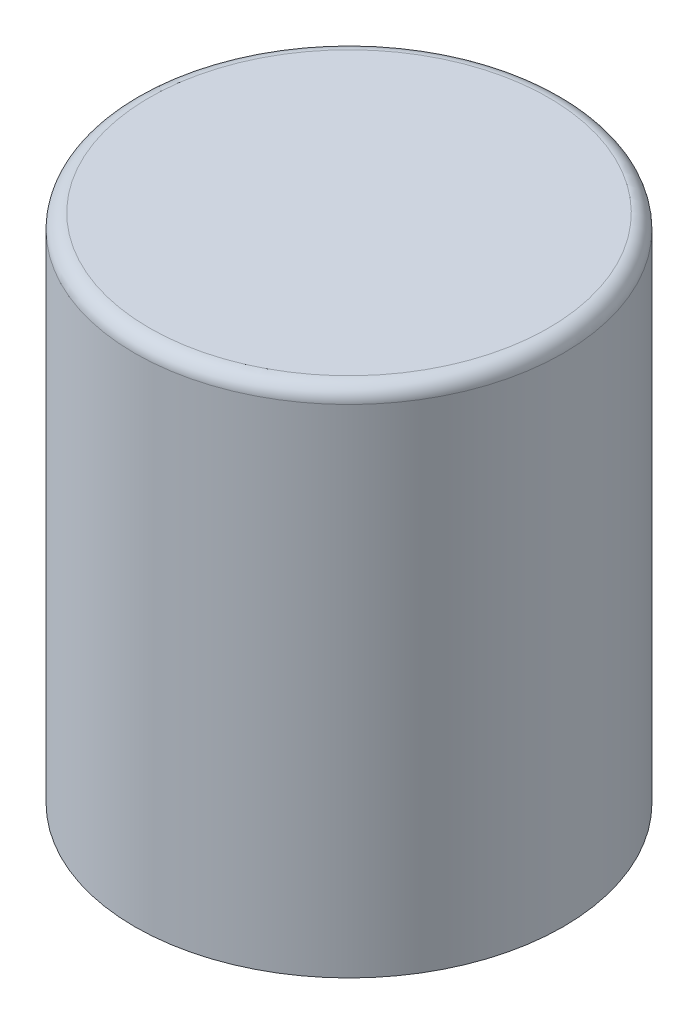
ISO-10303-21;
HEADER;
FILE_DESCRIPTION(('STEP AP214'),'2;1');
FILE_NAME('part.step','',(''),(''),'','','');
FILE_SCHEMA(('AUTOMOTIVE_DESIGN { 1 0 10303 214 1 1 1 1 }'));
ENDSEC;
DATA;
#1=APPLICATION_CONTEXT('core data for automotive mechanical design processes');
#2=APPLICATION_PROTOCOL_DEFINITION('international standard','automotive_design',2000,#1);
#3=PRODUCT_CONTEXT('',#1,'mechanical');
#4=PRODUCT('Part','Part','',(#3));
#5=PRODUCT_RELATED_PRODUCT_CATEGORY('part','',(#4));
#6=PRODUCT_DEFINITION_FORMATION('','',#4);
#7=PRODUCT_DEFINITION_CONTEXT('part definition',#1,'design');
#8=PRODUCT_DEFINITION('design','',#6,#7);
#9=PRODUCT_DEFINITION_SHAPE('','',#8);
#10=(LENGTH_UNIT() NAMED_UNIT(*) SI_UNIT(.MILLI.,.METRE.));
#11=(NAMED_UNIT(*) PLANE_ANGLE_UNIT() SI_UNIT($,.RADIAN.));
#12=(NAMED_UNIT(*) SI_UNIT($,.STERADIAN.) SOLID_ANGLE_UNIT());
#13=UNCERTAINTY_MEASURE_WITH_UNIT(LENGTH_MEASURE(1.E-05),#10,'distance_accuracy_value','');
#14=(GEOMETRIC_REPRESENTATION_CONTEXT(3) GLOBAL_UNCERTAINTY_ASSIGNED_CONTEXT((#13)) GLOBAL_UNIT_ASSIGNED_CONTEXT((#10,
#11,#12)) REPRESENTATION_CONTEXT('',''));
#15=CARTESIAN_POINT('',(0.,0.,0.));
#16=DIRECTION('',(0.,0.,1.));
#17=DIRECTION('',(1.,0.,0.));
#18=AXIS2_PLACEMENT_3D('',#15,#16,#17);
#19=CARTESIAN_POINT('',(0.,0.750000000000001,0.));
#20=DIRECTION('',(0.,-1.,0.));
#21=DIRECTION('',(0.,0.,-1.));
#22=AXIS2_PLACEMENT_3D('',#19,#20,#21);
#23=PLANE('',#22);
#24=DIRECTION('',(-1.,0.,0.));
#25=VECTOR('',#24,1.);
#26=CARTESIAN_POINT('',(2.25,0.750000000000001,0.5));
#27=LINE('',#26,#25);
#28=CARTESIAN_POINT('',(2.25,0.750000000000001,0.5));
#29=VERTEX_POINT('',#28);
#30=CARTESIAN_POINT('',(1.65,0.750000000000001,0.5));
#31=VERTEX_POINT('',#30);
#32=EDGE_CURVE('E162',#29,#31,#27,.T.);
#33=ORIENTED_EDGE('',*,*,#32,.F.);
#34=DIRECTION('',(0.,0.,1.));
#35=VECTOR('',#34,1.);
#36=CARTESIAN_POINT('',(2.25,0.750000000000001,-2.25));
#37=LINE('',#36,#35);
#38=CARTESIAN_POINT('',(2.25,0.750000000000001,2.25));
#39=VERTEX_POINT('',#38);
#40=EDGE_CURVE('E221',#29,#39,#37,.T.);
#41=ORIENTED_EDGE('',*,*,#40,.T.);
#42=DIRECTION('',(-1.,0.,0.));
#43=VECTOR('',#42,1.);
#44=CARTESIAN_POINT('',(2.25,0.750000000000001,2.25));
#45=LINE('',#44,#43);
#46=CARTESIAN_POINT('',(-2.25,0.750000000000001,2.25));
#47=VERTEX_POINT('',#46);
#48=EDGE_CURVE('E225',#39,#47,#45,.T.);
#49=ORIENTED_EDGE('',*,*,#48,.T.);
#50=DIRECTION('',(0.,0.,-1.));
#51=VECTOR('',#50,1.);
#52=CARTESIAN_POINT('',(-2.25,0.750000000000001,-2.25));
#53=LINE('',#52,#51);
#54=CARTESIAN_POINT('',(-2.25,0.750000000000001,0.5));
#55=VERTEX_POINT('',#54);
#56=EDGE_CURVE('E216',#47,#55,#53,.T.);
#57=ORIENTED_EDGE('',*,*,#56,.T.);
#58=CARTESIAN_POINT('',(-1.65,0.750000000000001,0.5));
#59=VERTEX_POINT('',#58);
#60=EDGE_CURVE('E309',#59,#55,#27,.T.);
#61=ORIENTED_EDGE('',*,*,#60,.F.);
#62=DIRECTION('',(0.,0.,-1.));
#63=VECTOR('',#62,1.);
#64=CARTESIAN_POINT('',(-1.65,0.750000000000001,-1.65));
#65=LINE('',#64,#63);
#66=CARTESIAN_POINT('',(-1.65,0.750000000000001,1.65));
#67=VERTEX_POINT('',#66);
#68=EDGE_CURVE('E183',#67,#59,#65,.T.);
#69=ORIENTED_EDGE('',*,*,#68,.F.);
#70=DIRECTION('',(-1.,0.,0.));
#71=VECTOR('',#70,1.);
#72=CARTESIAN_POINT('',(1.65,0.750000000000001,1.65));
#73=LINE('',#72,#71);
#74=CARTESIAN_POINT('',(1.65,0.750000000000001,1.65));
#75=VERTEX_POINT('',#74);
#76=EDGE_CURVE('E193',#75,#67,#73,.T.);
#77=ORIENTED_EDGE('',*,*,#76,.F.);
#78=DIRECTION('',(0.,0.,1.));
#79=VECTOR('',#78,1.);
#80=CARTESIAN_POINT('',(1.65,0.750000000000001,-1.65));
#81=LINE('',#80,#79);
#82=EDGE_CURVE('E189',#31,#75,#81,.T.);
#83=ORIENTED_EDGE('',*,*,#82,.F.);
#84=EDGE_LOOP('',(#33,#41,#49,#57,#61,#69,#77,#83));
#85=FACE_BOUND('',#84,.T.);
#86=ADVANCED_FACE('F33',(#85),#23,.T.);
#87=CARTESIAN_POINT('',(0.,9.75,0.));
#88=DIRECTION('',(0.,1.,0.));
#89=DIRECTION('',(0.,0.,1.));
#90=AXIS2_PLACEMENT_3D('',#87,#88,#89);
#91=PLANE('',#90);
#92=CARTESIAN_POINT('',(0.,9.75,0.));
#93=DIRECTION('',(0.,1.,0.));
#94=DIRECTION('',(0.,0.,1.));
#95=AXIS2_PLACEMENT_3D('',#92,#93,#94);
#96=CIRCLE('',#95,3.65);
#97=CARTESIAN_POINT('',(0.,9.75,-3.65));
#98=VERTEX_POINT('',#97);
#99=EDGE_CURVE('E251',#98,#98,#96,.T.);
#100=ORIENTED_EDGE('',*,*,#99,.F.);
#101=EDGE_LOOP('',(#100));
#102=FACE_BOUND('',#101,.T.);
#103=DIRECTION('',(0.,0.,-1.));
#104=VECTOR('',#103,1.);
#105=CARTESIAN_POINT('',(-2.25,9.75,-2.25));
#106=LINE('',#105,#104);
#107=CARTESIAN_POINT('',(-2.25,9.75,2.25));
#108=VERTEX_POINT('',#107);
#109=CARTESIAN_POINT('',(-2.25,9.75,-2.25));
#110=VERTEX_POINT('',#109);
#111=EDGE_CURVE('E215',#108,#110,#106,.T.);
#112=ORIENTED_EDGE('',*,*,#111,.F.);
#113=DIRECTION('',(-1.,0.,0.));
#114=VECTOR('',#113,1.);
#115=CARTESIAN_POINT('',(2.25,9.75,2.25));
#116=LINE('',#115,#114);
#117=CARTESIAN_POINT('',(2.25,9.75,2.25));
#118=VERTEX_POINT('',#117);
#119=EDGE_CURVE('E236',#118,#108,#116,.T.);
#120=ORIENTED_EDGE('',*,*,#119,.F.);
#121=DIRECTION('',(0.,0.,1.));
#122=VECTOR('',#121,1.);
#123=CARTESIAN_POINT('',(2.25,9.75,-2.25));
#124=LINE('',#123,#122);
#125=CARTESIAN_POINT('',(2.25,9.75,-2.25));
#126=VERTEX_POINT('',#125);
#127=EDGE_CURVE('E233',#126,#118,#124,.T.);
#128=ORIENTED_EDGE('',*,*,#127,.F.);
#129=DIRECTION('',(1.,0.,0.));
#130=VECTOR('',#129,1.);
#131=CARTESIAN_POINT('',(2.25,9.75,-2.25));
#132=LINE('',#131,#130);
#133=EDGE_CURVE('E230',#110,#126,#132,.T.);
#134=ORIENTED_EDGE('',*,*,#133,.F.);
#135=EDGE_LOOP('',(#112,#120,#128,#134));
#136=FACE_BOUND('',#135,.T.);
#137=ADVANCED_FACE('F279',(#102,#136),#91,.F.);
#138=CARTESIAN_POINT('',(0.,10.5,0.));
#139=DIRECTION('',(0.,-1.,0.));
#140=DIRECTION('',(0.,0.,-1.));
#141=AXIS2_PLACEMENT_3D('',#138,#139,#140);
#142=CYLINDRICAL_SURFACE('',#141,4.4);
#143=CARTESIAN_POINT('',(0.,10.2,0.));
#144=DIRECTION('',(0.,1.,0.));
#145=DIRECTION('',(0.,0.,1.));
#146=AXIS2_PLACEMENT_3D('',#143,#144,#145);
#147=CIRCLE('',#146,4.4);
#148=CARTESIAN_POINT('',(0.,10.2,-4.4));
#149=VERTEX_POINT('',#148);
#150=EDGE_CURVE('E11',#149,#149,#147,.F.);
#151=CARTESIAN_POINT('',(0.,0.,0.));
#152=DIRECTION('',(0.,1.,0.));
#153=DIRECTION('',(0.,0.,1.));
#154=AXIS2_PLACEMENT_3D('',#151,#152,#153);
#155=CIRCLE('',#154,4.4);
#156=CARTESIAN_POINT('',(0.,0.,-4.4));
#157=VERTEX_POINT('',#156);
#158=EDGE_CURVE('E254',#157,#157,#155,.T.);
#159=CARTESIAN_POINT('',(0.,10.2,-4.4));
#160=CARTESIAN_POINT('',(0.,10.09375,-4.4));
#161=CARTESIAN_POINT('',(0.,9.9875,-4.4));
#162=CARTESIAN_POINT('',(0.,9.775,-4.4));
#163=CARTESIAN_POINT('',(0.,9.66875,-4.4));
#164=CARTESIAN_POINT('',(0.,9.45625,-4.4));
#165=CARTESIAN_POINT('',(0.,9.35,-4.4));
#166=CARTESIAN_POINT('',(0.,9.1375,-4.4));
#167=CARTESIAN_POINT('',(0.,9.03125,-4.4));
#168=CARTESIAN_POINT('',(0.,8.81875,-4.4));
#169=CARTESIAN_POINT('',(0.,8.7125,-4.4));
#170=CARTESIAN_POINT('',(0.,8.5,-4.4));
#171=CARTESIAN_POINT('',(0.,8.39375,-4.4));
#172=CARTESIAN_POINT('',(0.,8.18125,-4.4));
#173=CARTESIAN_POINT('',(0.,8.075,-4.4));
#174=CARTESIAN_POINT('',(0.,7.8625,-4.4));
#175=CARTESIAN_POINT('',(0.,7.75625,-4.4));
#176=CARTESIAN_POINT('',(0.,7.54375,-4.4));
#177=CARTESIAN_POINT('',(0.,7.4375,-4.4));
#178=CARTESIAN_POINT('',(0.,7.225,-4.4));
#179=CARTESIAN_POINT('',(0.,7.11875,-4.4));
#180=CARTESIAN_POINT('',(0.,6.90625,-4.4));
#181=CARTESIAN_POINT('',(0.,6.8,-4.4));
#182=CARTESIAN_POINT('',(0.,6.5875,-4.4));
#183=CARTESIAN_POINT('',(0.,6.48125,-4.4));
#184=CARTESIAN_POINT('',(0.,6.26875,-4.4));
#185=CARTESIAN_POINT('',(0.,6.1625,-4.4));
#186=CARTESIAN_POINT('',(0.,5.95,-4.4));
#187=CARTESIAN_POINT('',(0.,5.84375,-4.4));
#188=CARTESIAN_POINT('',(0.,5.63125,-4.4));
#189=CARTESIAN_POINT('',(0.,5.525,-4.4));
#190=CARTESIAN_POINT('',(0.,5.3125,-4.4));
#191=CARTESIAN_POINT('',(0.,5.20625,-4.4));
#192=CARTESIAN_POINT('',(0.,4.99375,-4.4));
#193=CARTESIAN_POINT('',(0.,4.8875,-4.4));
#194=CARTESIAN_POINT('',(0.,4.675,-4.4));
#195=CARTESIAN_POINT('',(0.,4.56875,-4.4));
#196=CARTESIAN_POINT('',(0.,4.35625,-4.4));
#197=CARTESIAN_POINT('',(0.,4.25,-4.4));
#198=CARTESIAN_POINT('',(0.,4.0375,-4.4));
#199=CARTESIAN_POINT('',(0.,3.93125,-4.4));
#200=CARTESIAN_POINT('',(0.,3.71875,-4.4));
#201=CARTESIAN_POINT('',(0.,3.6125,-4.4));
#202=CARTESIAN_POINT('',(0.,3.4,-4.4));
#203=CARTESIAN_POINT('',(0.,3.29375,-4.4));
#204=CARTESIAN_POINT('',(0.,3.08125,-4.4));
#205=CARTESIAN_POINT('',(0.,2.975,-4.4));
#206=CARTESIAN_POINT('',(0.,2.7625,-4.4));
#207=CARTESIAN_POINT('',(0.,2.65625,-4.4));
#208=CARTESIAN_POINT('',(0.,2.44375,-4.4));
#209=CARTESIAN_POINT('',(0.,2.3375,-4.4));
#210=CARTESIAN_POINT('',(0.,2.125,-4.4));
#211=CARTESIAN_POINT('',(0.,2.01875,-4.4));
#212=CARTESIAN_POINT('',(0.,1.80625,-4.4));
#213=CARTESIAN_POINT('',(0.,1.7,-4.4));
#214=CARTESIAN_POINT('',(0.,1.4875,-4.4));
#215=CARTESIAN_POINT('',(0.,1.38125,-4.4));
#216=CARTESIAN_POINT('',(0.,1.16875,-4.4));
#217=CARTESIAN_POINT('',(0.,1.0625,-4.4));
#218=CARTESIAN_POINT('',(0.,0.85,-4.4));
#219=CARTESIAN_POINT('',(0.,0.74375,-4.4));
#220=CARTESIAN_POINT('',(0.,0.531249999999999,-4.4));
#221=CARTESIAN_POINT('',(0.,0.424999999999999,-4.4));
#222=CARTESIAN_POINT('',(0.,0.2125,-4.4));
#223=CARTESIAN_POINT('',(0.,0.10625,-4.4));
#224=CARTESIAN_POINT('',(0.,0.,-4.4));
#225=B_SPLINE_CURVE_WITH_KNOTS('',3,(#159,#160,#161,#162,#163,#164,#165,#166,#167,#168,#169,
#170,#171,#172,#173,#174,#175,#176,#177,#178,#179,#180,#181,#182,#183,#184,#185,#186,#187,#188,
#189,#190,#191,#192,#193,#194,#195,#196,#197,#198,#199,#200,#201,#202,#203,#204,#205,#206,#207,
#208,#209,#210,#211,#212,#213,#214,#215,#216,#217,#218,#219,#220,#221,#222,#223,#224),
.UNSPECIFIED.,.F.,.F.,(4,2,2,2,2,2,2,2,2,2,2,2,2,2,2,2,2,2,2,2,2,2,2,2,2,2,2,2,2,2,2,2,4),(0.,
0.31875,0.637499999999999,0.956249999999999,1.275,1.59375,1.9125,2.23125,2.55,2.86875,3.1875,
3.50625,3.825,4.14375,4.4625,4.78125,5.1,5.41875,5.7375,6.05625,6.375,6.69375,7.0125,7.33125,
7.65,7.96875,8.2875,8.60625,8.925,9.24375,9.5625,9.88125,10.2),.UNSPECIFIED.);
#226=EDGE_CURVE('BSEAM286',#149,#157,#225,.T.);
#227=ORIENTED_EDGE('',*,*,#150,.T.);
#228=ORIENTED_EDGE('',*,*,#158,.T.);
#229=ORIENTED_EDGE('',*,*,#226,.T.);
#230=ORIENTED_EDGE('',*,*,#226,.F.);
#231=EDGE_LOOP('',(#227,#229,#228,#230));
#232=FACE_BOUND('',#231,.T.);
#233=ADVANCED_FACE('F286',(#232),#142,.T.);
#234=CARTESIAN_POINT('',(0.,10.5,0.));
#235=DIRECTION('',(0.,1.,0.));
#236=DIRECTION('',(0.,0.,1.));
#237=AXIS2_PLACEMENT_3D('',#234,#235,#236);
#238=PLANE('',#237);
#239=CARTESIAN_POINT('',(0.,10.5,0.));
#240=DIRECTION('',(0.,1.,0.));
#241=DIRECTION('',(0.,0.,1.));
#242=AXIS2_PLACEMENT_3D('',#239,#240,#241);
#243=CIRCLE('',#242,4.1);
#244=CARTESIAN_POINT('',(0.,10.5,4.1));
#245=VERTEX_POINT('',#244);
#246=EDGE_CURVE('E41',#245,#245,#243,.T.);
#247=ORIENTED_EDGE('',*,*,#246,.T.);
#248=EDGE_LOOP('',(#247));
#249=FACE_BOUND('',#248,.T.);
#250=ADVANCED_FACE('F268',(#249),#238,.T.);
#251=CARTESIAN_POINT('',(0.,0.,0.));
#252=DIRECTION('',(0.,1.,0.));
#253=DIRECTION('',(0.,0.,1.));
#254=AXIS2_PLACEMENT_3D('',#251,#252,#253);
#255=PLANE('',#254);
#256=CARTESIAN_POINT('',(0.,0.,0.));
#257=DIRECTION('',(0.,1.,0.));
#258=DIRECTION('',(0.,0.,1.));
#259=AXIS2_PLACEMENT_3D('',#256,#257,#258);
#260=CIRCLE('',#259,3.65);
#261=CARTESIAN_POINT('',(0.,0.,-3.65));
#262=VERTEX_POINT('',#261);
#263=EDGE_CURVE('E250',#262,#262,#260,.T.);
#264=ORIENTED_EDGE('',*,*,#263,.T.);
#265=EDGE_LOOP('',(#264));
#266=FACE_BOUND('',#265,.T.);
#267=ORIENTED_EDGE('',*,*,#158,.F.);
#268=EDGE_LOOP('',(#267));
#269=FACE_BOUND('',#268,.T.);
#270=ADVANCED_FACE('F302',(#266,#269),#255,.F.);
#271=CARTESIAN_POINT('',(0.,10.5,0.));
#272=DIRECTION('',(0.,-1.,0.));
#273=DIRECTION('',(0.,0.,-1.));
#274=AXIS2_PLACEMENT_3D('',#271,#272,#273);
#275=CYLINDRICAL_SURFACE('',#274,3.65);
#276=CARTESIAN_POINT('',(0.,9.75,-3.65));
#277=CARTESIAN_POINT('',(0.,9.6484375,-3.65));
#278=CARTESIAN_POINT('',(0.,9.546875,-3.65));
#279=CARTESIAN_POINT('',(0.,9.34375,-3.65));
#280=CARTESIAN_POINT('',(0.,9.2421875,-3.65));
#281=CARTESIAN_POINT('',(0.,9.0390625,-3.65));
#282=CARTESIAN_POINT('',(0.,8.9375,-3.65));
#283=CARTESIAN_POINT('',(0.,8.734375,-3.65));
#284=CARTESIAN_POINT('',(0.,8.6328125,-3.65));
#285=CARTESIAN_POINT('',(0.,8.4296875,-3.65));
#286=CARTESIAN_POINT('',(0.,8.328125,-3.65));
#287=CARTESIAN_POINT('',(0.,8.125,-3.65));
#288=CARTESIAN_POINT('',(0.,8.0234375,-3.65));
#289=CARTESIAN_POINT('',(0.,7.8203125,-3.65));
#290=CARTESIAN_POINT('',(0.,7.71875,-3.65));
#291=CARTESIAN_POINT('',(0.,7.515625,-3.65));
#292=CARTESIAN_POINT('',(0.,7.4140625,-3.65));
#293=CARTESIAN_POINT('',(0.,7.2109375,-3.65));
#294=CARTESIAN_POINT('',(0.,7.109375,-3.65));
#295=CARTESIAN_POINT('',(0.,6.90625,-3.65));
#296=CARTESIAN_POINT('',(0.,6.8046875,-3.65));
#297=CARTESIAN_POINT('',(0.,6.6015625,-3.65));
#298=CARTESIAN_POINT('',(0.,6.5,-3.65));
#299=CARTESIAN_POINT('',(0.,6.296875,-3.65));
#300=CARTESIAN_POINT('',(0.,6.1953125,-3.65));
#301=CARTESIAN_POINT('',(0.,5.9921875,-3.65));
#302=CARTESIAN_POINT('',(0.,5.890625,-3.65));
#303=CARTESIAN_POINT('',(0.,5.6875,-3.65));
#304=CARTESIAN_POINT('',(0.,5.5859375,-3.65));
#305=CARTESIAN_POINT('',(0.,5.3828125,-3.65));
#306=CARTESIAN_POINT('',(0.,5.28125,-3.65));
#307=CARTESIAN_POINT('',(0.,5.078125,-3.65));
#308=CARTESIAN_POINT('',(0.,4.9765625,-3.65));
#309=CARTESIAN_POINT('',(0.,4.7734375,-3.65));
#310=CARTESIAN_POINT('',(0.,4.671875,-3.65));
#311=CARTESIAN_POINT('',(0.,4.46875,-3.65));
#312=CARTESIAN_POINT('',(0.,4.3671875,-3.65));
#313=CARTESIAN_POINT('',(0.,4.1640625,-3.65));
#314=CARTESIAN_POINT('',(0.,4.0625,-3.65));
#315=CARTESIAN_POINT('',(0.,3.859375,-3.65));
#316=CARTESIAN_POINT('',(0.,3.7578125,-3.65));
#317=CARTESIAN_POINT('',(0.,3.5546875,-3.65));
#318=CARTESIAN_POINT('',(0.,3.453125,-3.65));
#319=CARTESIAN_POINT('',(0.,3.25,-3.65));
#320=CARTESIAN_POINT('',(0.,3.1484375,-3.65));
#321=CARTESIAN_POINT('',(0.,2.9453125,-3.65));
#322=CARTESIAN_POINT('',(0.,2.84375,-3.65));
#323=CARTESIAN_POINT('',(0.,2.640625,-3.65));
#324=CARTESIAN_POINT('',(0.,2.5390625,-3.65));
#325=CARTESIAN_POINT('',(0.,2.3359375,-3.65));
#326=CARTESIAN_POINT('',(0.,2.234375,-3.65));
#327=CARTESIAN_POINT('',(0.,2.03125,-3.65));
#328=CARTESIAN_POINT('',(0.,1.9296875,-3.65));
#329=CARTESIAN_POINT('',(0.,1.7265625,-3.65));
#330=CARTESIAN_POINT('',(0.,1.625,-3.65));
#331=CARTESIAN_POINT('',(0.,1.421875,-3.65));
#332=CARTESIAN_POINT('',(0.,1.3203125,-3.65));
#333=CARTESIAN_POINT('',(0.,1.1171875,-3.65));
#334=CARTESIAN_POINT('',(0.,1.015625,-3.65));
#335=CARTESIAN_POINT('',(0.,0.8125,-3.65));
#336=CARTESIAN_POINT('',(0.,0.710937499999999,-3.65));
#337=CARTESIAN_POINT('',(0.,0.507812499999998,-3.65));
#338=CARTESIAN_POINT('',(0.,0.406249999999998,-3.65));
#339=CARTESIAN_POINT('',(0.,0.203124999999998,-3.65));
#340=CARTESIAN_POINT('',(0.,0.101562499999999,-3.65));
#341=CARTESIAN_POINT('',(0.,0.,-3.65));
#342=B_SPLINE_CURVE_WITH_KNOTS('',3,(#276,#277,#278,#279,#280,#281,#282,#283,#284,#285,#286,
#287,#288,#289,#290,#291,#292,#293,#294,#295,#296,#297,#298,#299,#300,#301,#302,#303,#304,#305,
#306,#307,#308,#309,#310,#311,#312,#313,#314,#315,#316,#317,#318,#319,#320,#321,#322,#323,#324,
#325,#326,#327,#328,#329,#330,#331,#332,#333,#334,#335,#336,#337,#338,#339,#340,#341),
.UNSPECIFIED.,.F.,.F.,(4,2,2,2,2,2,2,2,2,2,2,2,2,2,2,2,2,2,2,2,2,2,2,2,2,2,2,2,2,2,2,2,4),(0.,
0.304687500000001,0.609375000000001,0.914062500000002,1.21875,1.5234375,1.828125,2.1328125,
2.4375,2.7421875,3.046875,3.3515625,3.65625,3.9609375,4.265625,4.5703125,4.875,5.1796875,
5.484375,5.7890625,6.09375,6.3984375,6.703125,7.0078125,7.3125,7.6171875,7.921875,8.2265625,
8.53125,8.8359375,9.140625,9.4453125,9.75),.UNSPECIFIED.);
#343=EDGE_CURVE('BSEAM294',#98,#262,#342,.T.);
#344=ORIENTED_EDGE('',*,*,#99,.T.);
#345=ORIENTED_EDGE('',*,*,#263,.F.);
#346=ORIENTED_EDGE('',*,*,#343,.T.);
#347=ORIENTED_EDGE('',*,*,#343,.F.);
#348=EDGE_LOOP('',(#344,#346,#345,#347));
#349=FACE_BOUND('',#348,.T.);
#350=ADVANCED_FACE('F294',(#349),#275,.F.);
#351=DIRECTION('',(1.,0.,0.));
#352=VECTOR('',#351,1.);
#353=CARTESIAN_POINT('',(2.25,0.750000000000001,-0.5));
#354=LINE('',#353,#352);
#355=CARTESIAN_POINT('',(-2.25,0.750000000000001,-0.5));
#356=VERTEX_POINT('',#355);
#357=CARTESIAN_POINT('',(-1.65,0.750000000000001,-0.5));
#358=VERTEX_POINT('',#357);
#359=EDGE_CURVE('E306',#356,#358,#354,.T.);
#360=ORIENTED_EDGE('',*,*,#359,.F.);
#361=CARTESIAN_POINT('',(-2.25,0.750000000000001,-2.25));
#362=VERTEX_POINT('',#361);
#363=EDGE_CURVE('E167',#356,#362,#53,.T.);
#364=ORIENTED_EDGE('',*,*,#363,.T.);
#365=DIRECTION('',(1.,0.,0.));
#366=VECTOR('',#365,1.);
#367=CARTESIAN_POINT('',(2.25,0.750000000000001,-2.25));
#368=LINE('',#367,#366);
#369=CARTESIAN_POINT('',(2.25,0.750000000000001,-2.25));
#370=VERTEX_POINT('',#369);
#371=EDGE_CURVE('E219',#362,#370,#368,.T.);
#372=ORIENTED_EDGE('',*,*,#371,.T.);
#373=CARTESIAN_POINT('',(2.25,0.750000000000001,-0.5));
#374=VERTEX_POINT('',#373);
#375=EDGE_CURVE('E222',#370,#374,#37,.T.);
#376=ORIENTED_EDGE('',*,*,#375,.T.);
#377=CARTESIAN_POINT('',(1.65,0.750000000000001,-0.5));
#378=VERTEX_POINT('',#377);
#379=EDGE_CURVE('E310',#378,#374,#354,.T.);
#380=ORIENTED_EDGE('',*,*,#379,.F.);
#381=CARTESIAN_POINT('',(1.65,0.750000000000001,-1.65));
#382=VERTEX_POINT('',#381);
#383=EDGE_CURVE('E190',#382,#378,#81,.T.);
#384=ORIENTED_EDGE('',*,*,#383,.F.);
#385=DIRECTION('',(1.,0.,0.));
#386=VECTOR('',#385,1.);
#387=CARTESIAN_POINT('',(1.65,0.750000000000001,-1.65));
#388=LINE('',#387,#386);
#389=CARTESIAN_POINT('',(-1.65,0.750000000000001,-1.65));
#390=VERTEX_POINT('',#389);
#391=EDGE_CURVE('E186',#390,#382,#388,.T.);
#392=ORIENTED_EDGE('',*,*,#391,.F.);
#393=EDGE_CURVE('E187',#358,#390,#65,.T.);
#394=ORIENTED_EDGE('',*,*,#393,.F.);
#395=EDGE_LOOP('',(#360,#364,#372,#376,#380,#384,#392,#394));
#396=FACE_BOUND('',#395,.T.);
#397=ADVANCED_FACE('F282',(#396),#23,.T.);
#398=CARTESIAN_POINT('',(-2.25,0.750000000000001,-2.25));
#399=DIRECTION('',(1.,0.,0.));
#400=DIRECTION('',(0.,0.,-1.));
#401=AXIS2_PLACEMENT_3D('',#398,#399,#400);
#402=PLANE('',#401);
#403=DIRECTION('',(0.,0.,-1.));
#404=VECTOR('',#403,1.);
#405=CARTESIAN_POINT('',(-2.25,7.15,-0.5));
#406=LINE('',#405,#404);
#407=CARTESIAN_POINT('',(-2.25,7.15,0.5));
#408=VERTEX_POINT('',#407);
#409=CARTESIAN_POINT('',(-2.25,7.15,-0.5));
#410=VERTEX_POINT('',#409);
#411=EDGE_CURVE('E155',#408,#410,#406,.T.);
#412=ORIENTED_EDGE('',*,*,#411,.F.);
#413=DIRECTION('',(0.,-1.,0.));
#414=VECTOR('',#413,1.);
#415=CARTESIAN_POINT('',(-2.25,7.15,0.5));
#416=LINE('',#415,#414);
#417=EDGE_CURVE('E178',#408,#55,#416,.T.);
#418=ORIENTED_EDGE('',*,*,#417,.T.);
#419=ORIENTED_EDGE('',*,*,#56,.F.);
#420=DIRECTION('',(0.,1.,0.));
#421=VECTOR('',#420,1.);
#422=CARTESIAN_POINT('',(-2.25,0.750000000000001,2.25));
#423=LINE('',#422,#421);
#424=EDGE_CURVE('E227',#47,#108,#423,.T.);
#425=ORIENTED_EDGE('',*,*,#424,.T.);
#426=ORIENTED_EDGE('',*,*,#111,.T.);
#427=DIRECTION('',(0.,1.,0.));
#428=VECTOR('',#427,1.);
#429=CARTESIAN_POINT('',(-2.25,0.750000000000001,-2.25));
#430=LINE('',#429,#428);
#431=EDGE_CURVE('E247',#362,#110,#430,.T.);
#432=ORIENTED_EDGE('',*,*,#431,.F.);
#433=ORIENTED_EDGE('',*,*,#363,.F.);
#434=DIRECTION('',(0.,-1.,0.));
#435=VECTOR('',#434,1.);
#436=CARTESIAN_POINT('',(-2.25,7.15,-0.5));
#437=LINE('',#436,#435);
#438=EDGE_CURVE('E146',#410,#356,#437,.T.);
#439=ORIENTED_EDGE('',*,*,#438,.F.);
#440=EDGE_LOOP('',(#412,#418,#419,#425,#426,#432,#433,#439));
#441=FACE_BOUND('',#440,.T.);
#442=ADVANCED_FACE('F165',(#441),#402,.F.);
#443=CARTESIAN_POINT('',(2.25,0.750000000000001,-2.25));
#444=DIRECTION('',(0.,0.,1.));
#445=DIRECTION('',(1.,0.,0.));
#446=AXIS2_PLACEMENT_3D('',#443,#444,#445);
#447=PLANE('',#446);
#448=ORIENTED_EDGE('',*,*,#133,.T.);
#449=DIRECTION('',(0.,1.,0.));
#450=VECTOR('',#449,1.);
#451=CARTESIAN_POINT('',(2.25,0.750000000000001,-2.25));
#452=LINE('',#451,#450);
#453=EDGE_CURVE('E244',#370,#126,#452,.T.);
#454=ORIENTED_EDGE('',*,*,#453,.F.);
#455=ORIENTED_EDGE('',*,*,#371,.F.);
#456=ORIENTED_EDGE('',*,*,#431,.T.);
#457=EDGE_LOOP('',(#448,#454,#455,#456));
#458=FACE_BOUND('',#457,.T.);
#459=ADVANCED_FACE('F300',(#458),#447,.F.);
#460=CARTESIAN_POINT('',(2.25,0.750000000000001,-2.25));
#461=DIRECTION('',(-1.,0.,0.));
#462=DIRECTION('',(0.,0.,1.));
#463=AXIS2_PLACEMENT_3D('',#460,#461,#462);
#464=PLANE('',#463);
#465=ORIENTED_EDGE('',*,*,#40,.F.);
#466=DIRECTION('',(0.,-1.,0.));
#467=VECTOR('',#466,1.);
#468=CARTESIAN_POINT('',(2.25,7.15,0.5));
#469=LINE('',#468,#467);
#470=CARTESIAN_POINT('',(2.25,7.15,0.5));
#471=VERTEX_POINT('',#470);
#472=EDGE_CURVE('E171',#471,#29,#469,.T.);
#473=ORIENTED_EDGE('',*,*,#472,.F.);
#474=DIRECTION('',(0.,0.,1.));
#475=VECTOR('',#474,1.);
#476=CARTESIAN_POINT('',(2.25,7.15,-0.5));
#477=LINE('',#476,#475);
#478=CARTESIAN_POINT('',(2.25,7.15,-0.5));
#479=VERTEX_POINT('',#478);
#480=EDGE_CURVE('E151',#479,#471,#477,.T.);
#481=ORIENTED_EDGE('',*,*,#480,.F.);
#482=DIRECTION('',(0.,-1.,0.));
#483=VECTOR('',#482,1.);
#484=CARTESIAN_POINT('',(2.25,7.15,-0.5));
#485=LINE('',#484,#483);
#486=EDGE_CURVE('E168',#479,#374,#485,.T.);
#487=ORIENTED_EDGE('',*,*,#486,.T.);
#488=ORIENTED_EDGE('',*,*,#375,.F.);
#489=ORIENTED_EDGE('',*,*,#453,.T.);
#490=ORIENTED_EDGE('',*,*,#127,.T.);
#491=DIRECTION('',(0.,1.,0.));
#492=VECTOR('',#491,1.);
#493=CARTESIAN_POINT('',(2.25,0.750000000000001,2.25));
#494=LINE('',#493,#492);
#495=EDGE_CURVE('E241',#39,#118,#494,.T.);
#496=ORIENTED_EDGE('',*,*,#495,.F.);
#497=EDGE_LOOP('',(#465,#473,#481,#487,#488,#489,#490,#496));
#498=FACE_BOUND('',#497,.T.);
#499=ADVANCED_FACE('F325',(#498),#464,.F.);
#500=CARTESIAN_POINT('',(2.25,0.750000000000001,2.25));
#501=DIRECTION('',(0.,0.,-1.));
#502=DIRECTION('',(-1.,0.,0.));
#503=AXIS2_PLACEMENT_3D('',#500,#501,#502);
#504=PLANE('',#503);
#505=ORIENTED_EDGE('',*,*,#119,.T.);
#506=ORIENTED_EDGE('',*,*,#424,.F.);
#507=ORIENTED_EDGE('',*,*,#48,.F.);
#508=ORIENTED_EDGE('',*,*,#495,.T.);
#509=EDGE_LOOP('',(#505,#506,#507,#508));
#510=FACE_BOUND('',#509,.T.);
#511=ADVANCED_FACE('F329',(#510),#504,.F.);
#512=CARTESIAN_POINT('',(-1.65,0.750000000000001,-1.65));
#513=DIRECTION('',(1.,0.,0.));
#514=DIRECTION('',(0.,0.,-1.));
#515=AXIS2_PLACEMENT_3D('',#512,#513,#514);
#516=PLANE('',#515);
#517=DIRECTION('',(0.,-1.,0.));
#518=VECTOR('',#517,1.);
#519=CARTESIAN_POINT('',(-1.65,0.750000000000001,0.5));
#520=LINE('',#519,#518);
#521=CARTESIAN_POINT('',(-1.65,7.15,0.5));
#522=VERTEX_POINT('',#521);
#523=EDGE_CURVE('E180',#522,#59,#520,.T.);
#524=ORIENTED_EDGE('',*,*,#523,.F.);
#525=DIRECTION('',(0.,0.,-1.));
#526=VECTOR('',#525,1.);
#527=CARTESIAN_POINT('',(-1.65,7.15,-1.65));
#528=LINE('',#527,#526);
#529=CARTESIAN_POINT('',(-1.65,7.15,-0.5));
#530=VERTEX_POINT('',#529);
#531=EDGE_CURVE('E176',#522,#530,#528,.T.);
#532=ORIENTED_EDGE('',*,*,#531,.T.);
#533=DIRECTION('',(0.,1.,0.));
#534=VECTOR('',#533,1.);
#535=CARTESIAN_POINT('',(-1.65,0.750000000000001,-0.5));
#536=LINE('',#535,#534);
#537=EDGE_CURVE('E149',#358,#530,#536,.T.);
#538=ORIENTED_EDGE('',*,*,#537,.F.);
#539=ORIENTED_EDGE('',*,*,#393,.T.);
#540=DIRECTION('',(0.,1.,0.));
#541=VECTOR('',#540,1.);
#542=CARTESIAN_POINT('',(-1.65,0.750000000000001,-1.65));
#543=LINE('',#542,#541);
#544=CARTESIAN_POINT('',(-1.65,9.75,-1.65));
#545=VERTEX_POINT('',#544);
#546=EDGE_CURVE('E212',#390,#545,#543,.T.);
#547=ORIENTED_EDGE('',*,*,#546,.T.);
#548=DIRECTION('',(0.,0.,-1.));
#549=VECTOR('',#548,1.);
#550=CARTESIAN_POINT('',(-1.65,9.75,-1.65));
#551=LINE('',#550,#549);
#552=CARTESIAN_POINT('',(-1.65,9.75,1.65));
#553=VERTEX_POINT('',#552);
#554=EDGE_CURVE('E182',#553,#545,#551,.T.);
#555=ORIENTED_EDGE('',*,*,#554,.F.);
#556=DIRECTION('',(0.,1.,0.));
#557=VECTOR('',#556,1.);
#558=CARTESIAN_POINT('',(-1.65,0.750000000000001,1.65));
#559=LINE('',#558,#557);
#560=EDGE_CURVE('E195',#67,#553,#559,.T.);
#561=ORIENTED_EDGE('',*,*,#560,.F.);
#562=ORIENTED_EDGE('',*,*,#68,.T.);
#563=EDGE_LOOP('',(#524,#532,#538,#539,#547,#555,#561,#562));
#564=FACE_BOUND('',#563,.T.);
#565=ADVANCED_FACE('F337',(#564),#516,.T.);
#566=CARTESIAN_POINT('',(1.65,0.750000000000001,-1.65));
#567=DIRECTION('',(0.,0.,1.));
#568=DIRECTION('',(1.,0.,0.));
#569=AXIS2_PLACEMENT_3D('',#566,#567,#568);
#570=PLANE('',#569);
#571=DIRECTION('',(1.,0.,0.));
#572=VECTOR('',#571,1.);
#573=CARTESIAN_POINT('',(1.65,9.75,-1.65));
#574=LINE('',#573,#572);
#575=CARTESIAN_POINT('',(1.65,9.75,-1.65));
#576=VERTEX_POINT('',#575);
#577=EDGE_CURVE('E198',#545,#576,#574,.T.);
#578=ORIENTED_EDGE('',*,*,#577,.F.);
#579=ORIENTED_EDGE('',*,*,#546,.F.);
#580=ORIENTED_EDGE('',*,*,#391,.T.);
#581=DIRECTION('',(0.,1.,0.));
#582=VECTOR('',#581,1.);
#583=CARTESIAN_POINT('',(1.65,0.750000000000001,-1.65));
#584=LINE('',#583,#582);
#585=EDGE_CURVE('E210',#382,#576,#584,.T.);
#586=ORIENTED_EDGE('',*,*,#585,.T.);
#587=EDGE_LOOP('',(#578,#579,#580,#586));
#588=FACE_BOUND('',#587,.T.);
#589=ADVANCED_FACE('F420',(#588),#570,.T.);
#590=CARTESIAN_POINT('',(1.65,0.750000000000001,-1.65));
#591=DIRECTION('',(-1.,0.,0.));
#592=DIRECTION('',(0.,0.,1.));
#593=AXIS2_PLACEMENT_3D('',#590,#591,#592);
#594=PLANE('',#593);
#595=DIRECTION('',(0.,1.,0.));
#596=VECTOR('',#595,1.);
#597=CARTESIAN_POINT('',(1.65,0.750000000000001,0.5));
#598=LINE('',#597,#596);
#599=CARTESIAN_POINT('',(1.65,7.15,0.5));
#600=VERTEX_POINT('',#599);
#601=EDGE_CURVE('E264',#31,#600,#598,.T.);
#602=ORIENTED_EDGE('',*,*,#601,.F.);
#603=ORIENTED_EDGE('',*,*,#82,.T.);
#604=DIRECTION('',(0.,1.,0.));
#605=VECTOR('',#604,1.);
#606=CARTESIAN_POINT('',(1.65,0.750000000000001,1.65));
#607=LINE('',#606,#605);
#608=CARTESIAN_POINT('',(1.65,9.75,1.65));
#609=VERTEX_POINT('',#608);
#610=EDGE_CURVE('E208',#75,#609,#607,.T.);
#611=ORIENTED_EDGE('',*,*,#610,.T.);
#612=DIRECTION('',(0.,0.,1.));
#613=VECTOR('',#612,1.);
#614=CARTESIAN_POINT('',(1.65,9.75,-1.65));
#615=LINE('',#614,#613);
#616=EDGE_CURVE('E201',#576,#609,#615,.T.);
#617=ORIENTED_EDGE('',*,*,#616,.F.);
#618=ORIENTED_EDGE('',*,*,#585,.F.);
#619=ORIENTED_EDGE('',*,*,#383,.T.);
#620=DIRECTION('',(0.,-1.,0.));
#621=VECTOR('',#620,1.);
#622=CARTESIAN_POINT('',(1.65,0.750000000000001,-0.5));
#623=LINE('',#622,#621);
#624=CARTESIAN_POINT('',(1.65,7.15,-0.5));
#625=VERTEX_POINT('',#624);
#626=EDGE_CURVE('E262',#625,#378,#623,.T.);
#627=ORIENTED_EDGE('',*,*,#626,.F.);
#628=DIRECTION('',(0.,0.,1.));
#629=VECTOR('',#628,1.);
#630=CARTESIAN_POINT('',(1.65,7.15,-1.65));
#631=LINE('',#630,#629);
#632=EDGE_CURVE('E259',#625,#600,#631,.T.);
#633=ORIENTED_EDGE('',*,*,#632,.T.);
#634=EDGE_LOOP('',(#602,#603,#611,#617,#618,#619,#627,#633));
#635=FACE_BOUND('',#634,.T.);
#636=ADVANCED_FACE('F346',(#635),#594,.T.);
#637=CARTESIAN_POINT('',(1.65,0.750000000000001,1.65));
#638=DIRECTION('',(0.,0.,-1.));
#639=DIRECTION('',(-1.,0.,0.));
#640=AXIS2_PLACEMENT_3D('',#637,#638,#639);
#641=PLANE('',#640);
#642=DIRECTION('',(-1.,0.,0.));
#643=VECTOR('',#642,1.);
#644=CARTESIAN_POINT('',(1.65,9.75,1.65));
#645=LINE('',#644,#643);
#646=EDGE_CURVE('E204',#609,#553,#645,.T.);
#647=ORIENTED_EDGE('',*,*,#646,.F.);
#648=ORIENTED_EDGE('',*,*,#610,.F.);
#649=ORIENTED_EDGE('',*,*,#76,.T.);
#650=ORIENTED_EDGE('',*,*,#560,.T.);
#651=EDGE_LOOP('',(#647,#648,#649,#650));
#652=FACE_BOUND('',#651,.T.);
#653=ADVANCED_FACE('F343',(#652),#641,.T.);
#654=ORIENTED_EDGE('',*,*,#646,.T.);
#655=ORIENTED_EDGE('',*,*,#554,.T.);
#656=ORIENTED_EDGE('',*,*,#577,.T.);
#657=ORIENTED_EDGE('',*,*,#616,.T.);
#658=EDGE_LOOP('',(#654,#655,#656,#657));
#659=FACE_BOUND('',#658,.T.);
#660=ADVANCED_FACE('F289',(#659),#91,.F.);
#661=CARTESIAN_POINT('',(0.,7.15,0.));
#662=DIRECTION('',(0.,-1.,0.));
#663=DIRECTION('',(0.,0.,-1.));
#664=AXIS2_PLACEMENT_3D('',#661,#662,#663);
#665=PLANE('',#664);
#666=DIRECTION('',(1.,0.,0.));
#667=VECTOR('',#666,1.);
#668=CARTESIAN_POINT('',(2.25,7.15,-0.5));
#669=LINE('',#668,#667);
#670=EDGE_CURVE('E152',#625,#479,#669,.T.);
#671=ORIENTED_EDGE('',*,*,#670,.T.);
#672=ORIENTED_EDGE('',*,*,#480,.T.);
#673=DIRECTION('',(-1.,0.,0.));
#674=VECTOR('',#673,1.);
#675=CARTESIAN_POINT('',(2.25,7.15,0.5));
#676=LINE('',#675,#674);
#677=EDGE_CURVE('E56',#471,#600,#676,.T.);
#678=ORIENTED_EDGE('',*,*,#677,.T.);
#679=ORIENTED_EDGE('',*,*,#632,.F.);
#680=EDGE_LOOP('',(#671,#672,#678,#679));
#681=FACE_BOUND('',#680,.T.);
#682=ADVANCED_FACE('F276',(#681),#665,.T.);
#683=CARTESIAN_POINT('',(2.25,7.15,-0.5));
#684=DIRECTION('',(0.,0.,-1.));
#685=DIRECTION('',(-1.,0.,0.));
#686=AXIS2_PLACEMENT_3D('',#683,#684,#685);
#687=PLANE('',#686);
#688=ORIENTED_EDGE('',*,*,#626,.T.);
#689=ORIENTED_EDGE('',*,*,#379,.T.);
#690=ORIENTED_EDGE('',*,*,#486,.F.);
#691=ORIENTED_EDGE('',*,*,#670,.F.);
#692=EDGE_LOOP('',(#688,#689,#690,#691));
#693=FACE_BOUND('',#692,.T.);
#694=ADVANCED_FACE('F352',(#693),#687,.F.);
#695=CARTESIAN_POINT('',(2.25,7.15,0.5));
#696=DIRECTION('',(0.,0.,1.));
#697=DIRECTION('',(1.,0.,0.));
#698=AXIS2_PLACEMENT_3D('',#695,#696,#697);
#699=PLANE('',#698);
#700=ORIENTED_EDGE('',*,*,#601,.T.);
#701=ORIENTED_EDGE('',*,*,#677,.F.);
#702=ORIENTED_EDGE('',*,*,#472,.T.);
#703=ORIENTED_EDGE('',*,*,#32,.T.);
#704=EDGE_LOOP('',(#700,#701,#702,#703));
#705=FACE_BOUND('',#704,.T.);
#706=ADVANCED_FACE('F317',(#705),#699,.F.);
#707=ORIENTED_EDGE('',*,*,#523,.T.);
#708=ORIENTED_EDGE('',*,*,#60,.T.);
#709=ORIENTED_EDGE('',*,*,#417,.F.);
#710=EDGE_CURVE('E158',#522,#408,#676,.T.);
#711=ORIENTED_EDGE('',*,*,#710,.F.);
#712=EDGE_LOOP('',(#707,#708,#709,#711));
#713=FACE_BOUND('',#712,.T.);
#714=ADVANCED_FACE('F334',(#713),#699,.F.);
#715=ORIENTED_EDGE('',*,*,#537,.T.);
#716=EDGE_CURVE('E48',#410,#530,#669,.T.);
#717=ORIENTED_EDGE('',*,*,#716,.F.);
#718=ORIENTED_EDGE('',*,*,#438,.T.);
#719=ORIENTED_EDGE('',*,*,#359,.T.);
#720=EDGE_LOOP('',(#715,#717,#718,#719));
#721=FACE_BOUND('',#720,.T.);
#722=ADVANCED_FACE('F144',(#721),#687,.F.);
#723=ORIENTED_EDGE('',*,*,#710,.T.);
#724=ORIENTED_EDGE('',*,*,#411,.T.);
#725=ORIENTED_EDGE('',*,*,#716,.T.);
#726=ORIENTED_EDGE('',*,*,#531,.F.);
#727=EDGE_LOOP('',(#723,#724,#725,#726));
#728=FACE_BOUND('',#727,.T.);
#729=ADVANCED_FACE('F156',(#728),#665,.T.);
#730=CARTESIAN_POINT('',(0.,10.2,0.));
#731=DIRECTION('',(0.,1.,0.));
#732=DIRECTION('',(0.,0.,1.));
#733=AXIS2_PLACEMENT_3D('',#730,#731,#732);
#734=TOROIDAL_SURFACE('',#733,4.1,0.3);
#735=ORIENTED_EDGE('',*,*,#150,.F.);
#736=EDGE_LOOP('',(#735));
#737=FACE_BOUND('',#736,.T.);
#738=ORIENTED_EDGE('',*,*,#246,.F.);
#739=EDGE_LOOP('',(#738));
#740=FACE_BOUND('',#739,.T.);
#741=ADVANCED_FACE('F35',(#737,#740),#734,.T.);
#742=CLOSED_SHELL('',(#86,#137,#233,#250,#270,#350,#397,#442,#459,#499,#511,#565,#589,#636,#653,
#660,#682,#694,#706,#714,#722,#729,#741));
#743=MANIFOLD_SOLID_BREP('B2',#742);
#744=ADVANCED_BREP_SHAPE_REPRESENTATION('',(#18,#743),#14);
#745=SHAPE_DEFINITION_REPRESENTATION(#9,#744);
ENDSEC;
END-ISO-10303-21;
